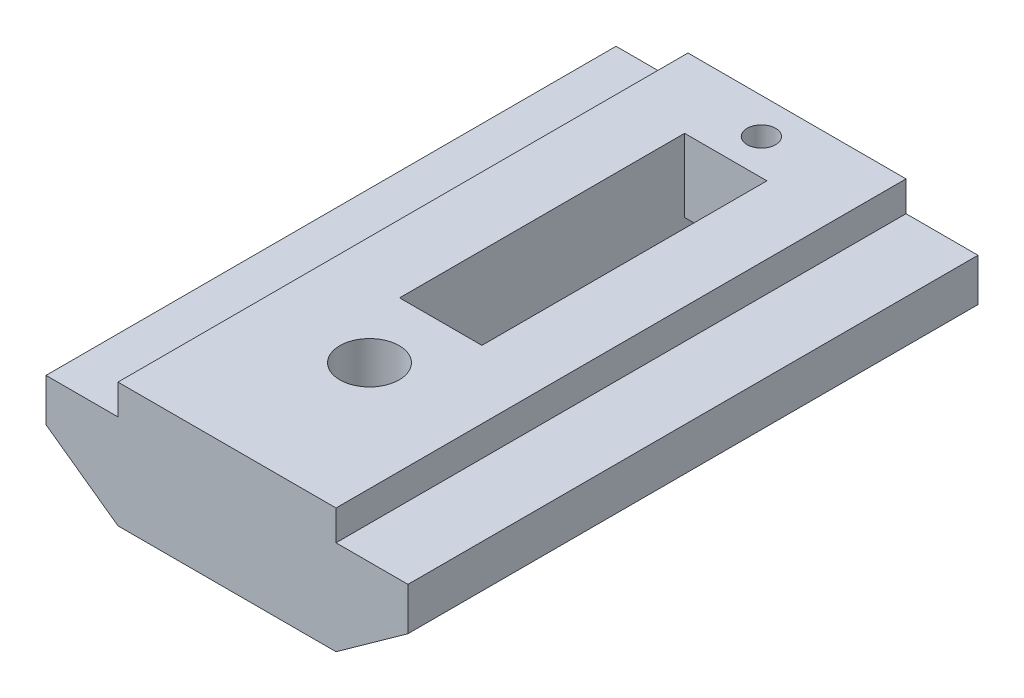
ISO-10303-21;
HEADER;
FILE_DESCRIPTION(('STEP AP214'),'2;1');
FILE_NAME('part.step','',(''),(''),'','','');
FILE_SCHEMA(('AUTOMOTIVE_DESIGN { 1 0 10303 214 1 1 1 1 }'));
ENDSEC;
DATA;
#1=APPLICATION_CONTEXT('core data for automotive mechanical design processes');
#2=APPLICATION_PROTOCOL_DEFINITION('international standard','automotive_design',2000,#1);
#3=PRODUCT_CONTEXT('',#1,'mechanical');
#4=PRODUCT('Part','Part','',(#3));
#5=PRODUCT_RELATED_PRODUCT_CATEGORY('part','',(#4));
#6=PRODUCT_DEFINITION_FORMATION('','',#4);
#7=PRODUCT_DEFINITION_CONTEXT('part definition',#1,'design');
#8=PRODUCT_DEFINITION('design','',#6,#7);
#9=PRODUCT_DEFINITION_SHAPE('','',#8);
#10=(LENGTH_UNIT() NAMED_UNIT(*) SI_UNIT(.MILLI.,.METRE.));
#11=(NAMED_UNIT(*) PLANE_ANGLE_UNIT() SI_UNIT($,.RADIAN.));
#12=(NAMED_UNIT(*) SI_UNIT($,.STERADIAN.) SOLID_ANGLE_UNIT());
#13=UNCERTAINTY_MEASURE_WITH_UNIT(LENGTH_MEASURE(1.E-05),#10,'distance_accuracy_value','');
#14=(GEOMETRIC_REPRESENTATION_CONTEXT(3) GLOBAL_UNCERTAINTY_ASSIGNED_CONTEXT((#13)) GLOBAL_UNIT_ASSIGNED_CONTEXT((#10,
#11,#12)) REPRESENTATION_CONTEXT('',''));
#15=CARTESIAN_POINT('',(0.,0.,0.));
#16=DIRECTION('',(0.,0.,1.));
#17=DIRECTION('',(1.,0.,0.));
#18=AXIS2_PLACEMENT_3D('',#15,#16,#17);
#19=CARTESIAN_POINT('',(0.,5.11666666666667,30.));
#20=DIRECTION('',(0.,-1.,0.));
#21=DIRECTION('',(0.,0.,-1.));
#22=AXIS2_PLACEMENT_3D('',#19,#20,#21);
#23=CYLINDRICAL_SURFACE('',#22,2.0828);
#24=CARTESIAN_POINT('',(0.,5.11666666666667,30.));
#25=DIRECTION('',(0.,-1.,0.));
#26=DIRECTION('',(0.,0.,-1.));
#27=AXIS2_PLACEMENT_3D('',#24,#25,#26);
#28=CIRCLE('',#27,2.0828);
#29=CARTESIAN_POINT('',(0.,5.11666666666667,27.9172));
#30=VERTEX_POINT('',#29);
#31=EDGE_CURVE('E171',#30,#30,#28,.T.);
#32=ORIENTED_EDGE('',*,*,#31,.F.);
#33=EDGE_LOOP('',(#32));
#34=FACE_BOUND('',#33,.T.);
#35=CARTESIAN_POINT('',(0.,-1.4102,30.));
#36=DIRECTION('',(0.,-1.,0.));
#37=DIRECTION('',(0.,0.,-1.));
#38=AXIS2_PLACEMENT_3D('',#35,#36,#37);
#39=CIRCLE('',#38,2.0828);
#40=CARTESIAN_POINT('',(0.,-1.4102,27.9172));
#41=VERTEX_POINT('',#40);
#42=EDGE_CURVE('E36',#41,#41,#39,.F.);
#43=ORIENTED_EDGE('',*,*,#42,.F.);
#44=EDGE_LOOP('',(#43));
#45=FACE_BOUND('',#44,.T.);
#46=ADVANCED_FACE('F32',(#34,#45),#23,.F.);
#47=CARTESIAN_POINT('',(7.65,5.11666666666667,40.));
#48=DIRECTION('',(-1.,0.,0.));
#49=DIRECTION('',(0.,-1.,0.));
#50=AXIS2_PLACEMENT_3D('',#47,#48,#49);
#51=PLANE('',#50);
#52=DIRECTION('',(0.,1.,0.));
#53=VECTOR('',#52,1.);
#54=CARTESIAN_POINT('',(7.65,5.11666666666667,0.));
#55=LINE('',#54,#53);
#56=CARTESIAN_POINT('',(7.65,3.,0.));
#57=VERTEX_POINT('',#56);
#58=CARTESIAN_POINT('',(7.65,5.11666666666667,0.));
#59=VERTEX_POINT('',#58);
#60=EDGE_CURVE('E185',#57,#59,#55,.T.);
#61=ORIENTED_EDGE('',*,*,#60,.T.);
#62=DIRECTION('',(0.,0.,-1.));
#63=VECTOR('',#62,1.);
#64=CARTESIAN_POINT('',(7.65,5.11666666666667,40.));
#65=LINE('',#64,#63);
#66=CARTESIAN_POINT('',(7.65,5.11666666666667,40.));
#67=VERTEX_POINT('',#66);
#68=EDGE_CURVE('E11',#67,#59,#65,.T.);
#69=ORIENTED_EDGE('',*,*,#68,.F.);
#70=DIRECTION('',(0.,1.,0.));
#71=VECTOR('',#70,1.);
#72=CARTESIAN_POINT('',(7.65,5.11666666666667,40.));
#73=LINE('',#72,#71);
#74=CARTESIAN_POINT('',(7.65,3.,40.));
#75=VERTEX_POINT('',#74);
#76=EDGE_CURVE('E187',#75,#67,#73,.T.);
#77=ORIENTED_EDGE('',*,*,#76,.F.);
#78=DIRECTION('',(0.,0.,-1.));
#79=VECTOR('',#78,1.);
#80=CARTESIAN_POINT('',(7.65,3.,40.));
#81=LINE('',#80,#79);
#82=EDGE_CURVE('E209',#75,#57,#81,.T.);
#83=ORIENTED_EDGE('',*,*,#82,.T.);
#84=EDGE_LOOP('',(#61,#69,#77,#83));
#85=FACE_BOUND('',#84,.T.);
#86=ADVANCED_FACE('F34',(#85),#51,.F.);
#87=CARTESIAN_POINT('',(-7.65,5.11666666666667,40.));
#88=DIRECTION('',(0.,-1.,0.));
#89=DIRECTION('',(1.,0.,0.));
#90=AXIS2_PLACEMENT_3D('',#87,#88,#89);
#91=PLANE('',#90);
#92=DIRECTION('',(1.,0.,0.));
#93=VECTOR('',#92,1.);
#94=CARTESIAN_POINT('',(-2.88833370117836,5.11666666666667,5.));
#95=LINE('',#94,#93);
#96=CARTESIAN_POINT('',(-2.88833370117836,5.11666666666667,5.));
#97=VERTEX_POINT('',#96);
#98=CARTESIAN_POINT('',(2.88833370117836,5.11666666666667,5.));
#99=VERTEX_POINT('',#98);
#100=EDGE_CURVE('E183',#97,#99,#95,.T.);
#101=ORIENTED_EDGE('',*,*,#100,.T.);
#102=DIRECTION('',(0.,0.,1.));
#103=VECTOR('',#102,1.);
#104=CARTESIAN_POINT('',(2.88833370117835,5.11666666666667,25.));
#105=LINE('',#104,#103);
#106=CARTESIAN_POINT('',(2.88833370117835,5.11666666666667,25.));
#107=VERTEX_POINT('',#106);
#108=EDGE_CURVE('E166',#99,#107,#105,.T.);
#109=ORIENTED_EDGE('',*,*,#108,.T.);
#110=DIRECTION('',(-1.,0.,0.));
#111=VECTOR('',#110,1.);
#112=CARTESIAN_POINT('',(-2.88833370117836,5.11666666666667,25.));
#113=LINE('',#112,#111);
#114=CARTESIAN_POINT('',(-2.88833370117837,5.11666666666667,25.));
#115=VERTEX_POINT('',#114);
#116=EDGE_CURVE('E322',#107,#115,#113,.T.);
#117=ORIENTED_EDGE('',*,*,#116,.T.);
#118=DIRECTION('',(0.,0.,-1.));
#119=VECTOR('',#118,1.);
#120=CARTESIAN_POINT('',(-2.88833370117836,5.11666666666667,25.));
#121=LINE('',#120,#119);
#122=EDGE_CURVE('E56',#115,#97,#121,.T.);
#123=ORIENTED_EDGE('',*,*,#122,.T.);
#124=EDGE_LOOP('',(#101,#109,#117,#123));
#125=FACE_BOUND('',#124,.T.);
#126=ORIENTED_EDGE('',*,*,#31,.T.);
#127=EDGE_LOOP('',(#126));
#128=FACE_BOUND('',#127,.T.);
#129=CARTESIAN_POINT('',(0.,5.11666666666667,2.5));
#130=DIRECTION('',(0.,-1.,0.));
#131=DIRECTION('',(0.,0.,-1.));
#132=AXIS2_PLACEMENT_3D('',#129,#130,#131);
#133=CIRCLE('',#132,1.);
#134=CARTESIAN_POINT('',(0.,5.11666666666667,1.5));
#135=VERTEX_POINT('',#134);
#136=EDGE_CURVE('E168',#135,#135,#133,.T.);
#137=ORIENTED_EDGE('',*,*,#136,.T.);
#138=EDGE_LOOP('',(#137));
#139=FACE_BOUND('',#138,.T.);
#140=DIRECTION('',(-1.,0.,0.));
#141=VECTOR('',#140,1.);
#142=CARTESIAN_POINT('',(-7.65,5.11666666666667,0.));
#143=LINE('',#142,#141);
#144=CARTESIAN_POINT('',(-7.65,5.11666666666667,0.));
#145=VERTEX_POINT('',#144);
#146=EDGE_CURVE('E212',#59,#145,#143,.T.);
#147=ORIENTED_EDGE('',*,*,#146,.T.);
#148=DIRECTION('',(0.,0.,-1.));
#149=VECTOR('',#148,1.);
#150=CARTESIAN_POINT('',(-7.65,5.11666666666667,40.));
#151=LINE('',#150,#149);
#152=CARTESIAN_POINT('',(-7.65,5.11666666666667,40.));
#153=VERTEX_POINT('',#152);
#154=EDGE_CURVE('E41',#153,#145,#151,.T.);
#155=ORIENTED_EDGE('',*,*,#154,.F.);
#156=DIRECTION('',(-1.,0.,0.));
#157=VECTOR('',#156,1.);
#158=CARTESIAN_POINT('',(-7.65,5.11666666666667,40.));
#159=LINE('',#158,#157);
#160=EDGE_CURVE('E190',#67,#153,#159,.T.);
#161=ORIENTED_EDGE('',*,*,#160,.F.);
#162=ORIENTED_EDGE('',*,*,#68,.T.);
#163=EDGE_LOOP('',(#147,#155,#161,#162));
#164=FACE_BOUND('',#163,.T.);
#165=ADVANCED_FACE('F282',(#125,#128,#139,#164),#91,.F.);
#166=CARTESIAN_POINT('',(-7.65,5.11666666666667,40.));
#167=DIRECTION('',(1.,0.,0.));
#168=DIRECTION('',(0.,1.,0.));
#169=AXIS2_PLACEMENT_3D('',#166,#167,#168);
#170=PLANE('',#169);
#171=DIRECTION('',(0.,-1.,0.));
#172=VECTOR('',#171,1.);
#173=CARTESIAN_POINT('',(-7.65,5.11666666666667,0.));
#174=LINE('',#173,#172);
#175=CARTESIAN_POINT('',(-7.65,3.,0.));
#176=VERTEX_POINT('',#175);
#177=EDGE_CURVE('E214',#145,#176,#174,.T.);
#178=ORIENTED_EDGE('',*,*,#177,.T.);
#179=DIRECTION('',(0.,0.,-1.));
#180=VECTOR('',#179,1.);
#181=CARTESIAN_POINT('',(-7.65,3.,40.));
#182=LINE('',#181,#180);
#183=CARTESIAN_POINT('',(-7.65,3.,40.));
#184=VERTEX_POINT('',#183);
#185=EDGE_CURVE('E251',#184,#176,#182,.T.);
#186=ORIENTED_EDGE('',*,*,#185,.F.);
#187=DIRECTION('',(0.,-1.,0.));
#188=VECTOR('',#187,1.);
#189=CARTESIAN_POINT('',(-7.65,5.11666666666667,40.));
#190=LINE('',#189,#188);
#191=EDGE_CURVE('E193',#153,#184,#190,.T.);
#192=ORIENTED_EDGE('',*,*,#191,.F.);
#193=ORIENTED_EDGE('',*,*,#154,.T.);
#194=EDGE_LOOP('',(#178,#186,#192,#193));
#195=FACE_BOUND('',#194,.T.);
#196=ADVANCED_FACE('F259',(#195),#170,.F.);
#197=CARTESIAN_POINT('',(-12.7,3.,40.));
#198=DIRECTION('',(0.,-1.,0.));
#199=DIRECTION('',(1.,0.,0.));
#200=AXIS2_PLACEMENT_3D('',#197,#198,#199);
#201=PLANE('',#200);
#202=DIRECTION('',(-1.,0.,0.));
#203=VECTOR('',#202,1.);
#204=CARTESIAN_POINT('',(-12.7,3.,0.));
#205=LINE('',#204,#203);
#206=CARTESIAN_POINT('',(-12.7,3.,0.));
#207=VERTEX_POINT('',#206);
#208=EDGE_CURVE('E216',#176,#207,#205,.T.);
#209=ORIENTED_EDGE('',*,*,#208,.T.);
#210=DIRECTION('',(0.,0.,-1.));
#211=VECTOR('',#210,1.);
#212=CARTESIAN_POINT('',(-12.7,3.,40.));
#213=LINE('',#212,#211);
#214=CARTESIAN_POINT('',(-12.7,3.,40.));
#215=VERTEX_POINT('',#214);
#216=EDGE_CURVE('E248',#215,#207,#213,.T.);
#217=ORIENTED_EDGE('',*,*,#216,.F.);
#218=DIRECTION('',(-1.,0.,0.));
#219=VECTOR('',#218,1.);
#220=CARTESIAN_POINT('',(-12.7,3.,40.));
#221=LINE('',#220,#219);
#222=EDGE_CURVE('E195',#184,#215,#221,.T.);
#223=ORIENTED_EDGE('',*,*,#222,.F.);
#224=ORIENTED_EDGE('',*,*,#185,.T.);
#225=EDGE_LOOP('',(#209,#217,#223,#224));
#226=FACE_BOUND('',#225,.T.);
#227=ADVANCED_FACE('F270',(#226),#201,.F.);
#228=CARTESIAN_POINT('',(-12.7,0.,40.));
#229=DIRECTION('',(1.,0.,0.));
#230=DIRECTION('',(0.,0.,-1.));
#231=AXIS2_PLACEMENT_3D('',#228,#229,#230);
#232=PLANE('',#231);
#233=DIRECTION('',(0.,-1.,0.));
#234=VECTOR('',#233,1.);
#235=CARTESIAN_POINT('',(-12.7,0.,0.));
#236=LINE('',#235,#234);
#237=CARTESIAN_POINT('',(-12.7,0.,0.));
#238=VERTEX_POINT('',#237);
#239=EDGE_CURVE('E218',#207,#238,#236,.T.);
#240=ORIENTED_EDGE('',*,*,#239,.T.);
#241=DIRECTION('',(0.,0.,-1.));
#242=VECTOR('',#241,1.);
#243=CARTESIAN_POINT('',(-12.7,0.,40.));
#244=LINE('',#243,#242);
#245=CARTESIAN_POINT('',(-12.7,0.,40.));
#246=VERTEX_POINT('',#245);
#247=EDGE_CURVE('E245',#246,#238,#244,.T.);
#248=ORIENTED_EDGE('',*,*,#247,.F.);
#249=DIRECTION('',(0.,-1.,0.));
#250=VECTOR('',#249,1.);
#251=CARTESIAN_POINT('',(-12.7,0.,40.));
#252=LINE('',#251,#250);
#253=EDGE_CURVE('E197',#215,#246,#252,.T.);
#254=ORIENTED_EDGE('',*,*,#253,.F.);
#255=ORIENTED_EDGE('',*,*,#216,.T.);
#256=EDGE_LOOP('',(#240,#248,#254,#255));
#257=FACE_BOUND('',#256,.T.);
#258=ADVANCED_FACE('F274',(#257),#232,.F.);
#259=CARTESIAN_POINT('',(-12.7,0.,40.));
#260=DIRECTION('',(0.582607545772361,0.812753620483543,0.));
#261=DIRECTION('',(-0.812753620483543,0.582607545772361,0.));
#262=AXIS2_PLACEMENT_3D('',#259,#260,#261);
#263=PLANE('',#262);
#264=DIRECTION('',(0.812753620483542,-0.582607545772361,0.));
#265=VECTOR('',#264,1.);
#266=CARTESIAN_POINT('',(-12.7,0.,0.));
#267=LINE('',#266,#265);
#268=CARTESIAN_POINT('',(-7.65,-3.62,0.));
#269=VERTEX_POINT('',#268);
#270=EDGE_CURVE('E220',#238,#269,#267,.T.);
#271=ORIENTED_EDGE('',*,*,#270,.T.);
#272=DIRECTION('',(0.,0.,-1.));
#273=VECTOR('',#272,1.);
#274=CARTESIAN_POINT('',(-7.65,-3.62,40.));
#275=LINE('',#274,#273);
#276=CARTESIAN_POINT('',(-7.65,-3.62,40.));
#277=VERTEX_POINT('',#276);
#278=EDGE_CURVE('E242',#277,#269,#275,.T.);
#279=ORIENTED_EDGE('',*,*,#278,.F.);
#280=DIRECTION('',(0.812753620483542,-0.582607545772361,0.));
#281=VECTOR('',#280,1.);
#282=CARTESIAN_POINT('',(-12.7,0.,40.));
#283=LINE('',#282,#281);
#284=EDGE_CURVE('E199',#246,#277,#283,.T.);
#285=ORIENTED_EDGE('',*,*,#284,.F.);
#286=ORIENTED_EDGE('',*,*,#247,.T.);
#287=EDGE_LOOP('',(#271,#279,#285,#286));
#288=FACE_BOUND('',#287,.T.);
#289=ADVANCED_FACE('F330',(#288),#263,.F.);
#290=CARTESIAN_POINT('',(7.65,-3.62,40.));
#291=DIRECTION('',(0.,1.,0.));
#292=DIRECTION('',(0.,0.,1.));
#293=AXIS2_PLACEMENT_3D('',#290,#291,#292);
#294=PLANE('',#293);
#295=CARTESIAN_POINT('',(0.,-3.62,30.));
#296=DIRECTION('',(0.,-1.,0.));
#297=DIRECTION('',(0.,0.,-1.));
#298=AXIS2_PLACEMENT_3D('',#295,#296,#297);
#299=CIRCLE('',#298,4.0005);
#300=CARTESIAN_POINT('',(0.,-3.62,25.9995));
#301=VERTEX_POINT('',#300);
#302=EDGE_CURVE('E526',#301,#301,#299,.T.);
#303=ORIENTED_EDGE('',*,*,#302,.F.);
#304=EDGE_LOOP('',(#303));
#305=FACE_BOUND('',#304,.T.);
#306=DIRECTION('',(0.,0.,1.));
#307=VECTOR('',#306,1.);
#308=CARTESIAN_POINT('',(2.88833370117835,-3.62,25.));
#309=LINE('',#308,#307);
#310=CARTESIAN_POINT('',(2.88833370117836,-3.62,0.));
#311=VERTEX_POINT('',#310);
#312=CARTESIAN_POINT('',(2.88833370117835,-3.62,25.));
#313=VERTEX_POINT('',#312);
#314=EDGE_CURVE('E306',#311,#313,#309,.T.);
#315=ORIENTED_EDGE('',*,*,#314,.F.);
#316=DIRECTION('',(1.,0.,0.));
#317=VECTOR('',#316,1.);
#318=CARTESIAN_POINT('',(7.65,-3.62,0.));
#319=LINE('',#318,#317);
#320=CARTESIAN_POINT('',(7.65,-3.62,0.));
#321=VERTEX_POINT('',#320);
#322=EDGE_CURVE('E222',#311,#321,#319,.T.);
#323=ORIENTED_EDGE('',*,*,#322,.T.);
#324=DIRECTION('',(0.,0.,-1.));
#325=VECTOR('',#324,1.);
#326=CARTESIAN_POINT('',(7.65,-3.62,40.));
#327=LINE('',#326,#325);
#328=CARTESIAN_POINT('',(7.65,-3.62,40.));
#329=VERTEX_POINT('',#328);
#330=EDGE_CURVE('E239',#329,#321,#327,.T.);
#331=ORIENTED_EDGE('',*,*,#330,.F.);
#332=DIRECTION('',(1.,0.,0.));
#333=VECTOR('',#332,1.);
#334=CARTESIAN_POINT('',(7.65,-3.62,40.));
#335=LINE('',#334,#333);
#336=EDGE_CURVE('E201',#277,#329,#335,.T.);
#337=ORIENTED_EDGE('',*,*,#336,.F.);
#338=ORIENTED_EDGE('',*,*,#278,.T.);
#339=CARTESIAN_POINT('',(-2.88833370117836,-3.62,0.));
#340=VERTEX_POINT('',#339);
#341=EDGE_CURVE('E223',#269,#340,#319,.T.);
#342=ORIENTED_EDGE('',*,*,#341,.T.);
#343=DIRECTION('',(0.,0.,-1.));
#344=VECTOR('',#343,1.);
#345=CARTESIAN_POINT('',(-2.88833370117836,-3.62,25.));
#346=LINE('',#345,#344);
#347=CARTESIAN_POINT('',(-2.88833370117836,-3.62,25.));
#348=VERTEX_POINT('',#347);
#349=EDGE_CURVE('E176',#348,#340,#346,.T.);
#350=ORIENTED_EDGE('',*,*,#349,.F.);
#351=DIRECTION('',(-1.,0.,0.));
#352=VECTOR('',#351,1.);
#353=CARTESIAN_POINT('',(-2.88833370117836,-3.62,25.));
#354=LINE('',#353,#352);
#355=EDGE_CURVE('E309',#313,#348,#354,.T.);
#356=ORIENTED_EDGE('',*,*,#355,.F.);
#357=EDGE_LOOP('',(#315,#323,#331,#337,#338,#342,#350,#356));
#358=FACE_BOUND('',#357,.T.);
#359=ADVANCED_FACE('F303',(#305,#358),#294,.F.);
#360=CARTESIAN_POINT('',(7.65,-3.62,40.));
#361=DIRECTION('',(-0.582607545772361,0.812753620483543,0.));
#362=DIRECTION('',(-0.812753620483543,-0.582607545772361,0.));
#363=AXIS2_PLACEMENT_3D('',#360,#361,#362);
#364=PLANE('',#363);
#365=DIRECTION('',(0.812753620483542,0.582607545772361,0.));
#366=VECTOR('',#365,1.);
#367=CARTESIAN_POINT('',(7.65,-3.62,0.));
#368=LINE('',#367,#366);
#369=CARTESIAN_POINT('',(12.7,0.,0.));
#370=VERTEX_POINT('',#369);
#371=EDGE_CURVE('E226',#321,#370,#368,.T.);
#372=ORIENTED_EDGE('',*,*,#371,.T.);
#373=DIRECTION('',(0.,0.,-1.));
#374=VECTOR('',#373,1.);
#375=CARTESIAN_POINT('',(12.7,0.,40.));
#376=LINE('',#375,#374);
#377=CARTESIAN_POINT('',(12.7,0.,40.));
#378=VERTEX_POINT('',#377);
#379=EDGE_CURVE('E236',#378,#370,#376,.T.);
#380=ORIENTED_EDGE('',*,*,#379,.F.);
#381=DIRECTION('',(0.812753620483542,0.582607545772361,0.));
#382=VECTOR('',#381,1.);
#383=CARTESIAN_POINT('',(7.65,-3.62,40.));
#384=LINE('',#383,#382);
#385=EDGE_CURVE('E203',#329,#378,#384,.T.);
#386=ORIENTED_EDGE('',*,*,#385,.F.);
#387=ORIENTED_EDGE('',*,*,#330,.T.);
#388=EDGE_LOOP('',(#372,#380,#386,#387));
#389=FACE_BOUND('',#388,.T.);
#390=ADVANCED_FACE('F298',(#389),#364,.F.);
#391=CARTESIAN_POINT('',(12.7,0.,40.));
#392=DIRECTION('',(-1.,0.,0.));
#393=DIRECTION('',(0.,0.,1.));
#394=AXIS2_PLACEMENT_3D('',#391,#392,#393);
#395=PLANE('',#394);
#396=DIRECTION('',(0.,1.,0.));
#397=VECTOR('',#396,1.);
#398=CARTESIAN_POINT('',(12.7,0.,0.));
#399=LINE('',#398,#397);
#400=CARTESIAN_POINT('',(12.7,3.,0.));
#401=VERTEX_POINT('',#400);
#402=EDGE_CURVE('E228',#370,#401,#399,.T.);
#403=ORIENTED_EDGE('',*,*,#402,.T.);
#404=DIRECTION('',(0.,0.,-1.));
#405=VECTOR('',#404,1.);
#406=CARTESIAN_POINT('',(12.7,3.,40.));
#407=LINE('',#406,#405);
#408=CARTESIAN_POINT('',(12.7,3.,40.));
#409=VERTEX_POINT('',#408);
#410=EDGE_CURVE('E233',#409,#401,#407,.T.);
#411=ORIENTED_EDGE('',*,*,#410,.F.);
#412=DIRECTION('',(0.,1.,0.));
#413=VECTOR('',#412,1.);
#414=CARTESIAN_POINT('',(12.7,0.,40.));
#415=LINE('',#414,#413);
#416=EDGE_CURVE('E205',#378,#409,#415,.T.);
#417=ORIENTED_EDGE('',*,*,#416,.F.);
#418=ORIENTED_EDGE('',*,*,#379,.T.);
#419=EDGE_LOOP('',(#403,#411,#417,#418));
#420=FACE_BOUND('',#419,.T.);
#421=ADVANCED_FACE('F294',(#420),#395,.F.);
#422=CARTESIAN_POINT('',(12.7,3.,40.));
#423=DIRECTION('',(0.,-1.,0.));
#424=DIRECTION('',(1.,0.,0.));
#425=AXIS2_PLACEMENT_3D('',#422,#423,#424);
#426=PLANE('',#425);
#427=DIRECTION('',(-1.,0.,0.));
#428=VECTOR('',#427,1.);
#429=CARTESIAN_POINT('',(12.7,3.,0.));
#430=LINE('',#429,#428);
#431=EDGE_CURVE('E191',#401,#57,#430,.T.);
#432=ORIENTED_EDGE('',*,*,#431,.T.);
#433=ORIENTED_EDGE('',*,*,#82,.F.);
#434=DIRECTION('',(-1.,0.,0.));
#435=VECTOR('',#434,1.);
#436=CARTESIAN_POINT('',(12.7,3.,40.));
#437=LINE('',#436,#435);
#438=EDGE_CURVE('E207',#409,#75,#437,.T.);
#439=ORIENTED_EDGE('',*,*,#438,.F.);
#440=ORIENTED_EDGE('',*,*,#410,.T.);
#441=EDGE_LOOP('',(#432,#433,#439,#440));
#442=FACE_BOUND('',#441,.T.);
#443=ADVANCED_FACE('F289',(#442),#426,.F.);
#444=CARTESIAN_POINT('',(0.,0.,40.));
#445=DIRECTION('',(0.,0.,-1.));
#446=DIRECTION('',(-1.,0.,0.));
#447=AXIS2_PLACEMENT_3D('',#444,#445,#446);
#448=PLANE('',#447);
#449=ORIENTED_EDGE('',*,*,#76,.T.);
#450=ORIENTED_EDGE('',*,*,#160,.T.);
#451=ORIENTED_EDGE('',*,*,#191,.T.);
#452=ORIENTED_EDGE('',*,*,#222,.T.);
#453=ORIENTED_EDGE('',*,*,#253,.T.);
#454=ORIENTED_EDGE('',*,*,#284,.T.);
#455=ORIENTED_EDGE('',*,*,#336,.T.);
#456=ORIENTED_EDGE('',*,*,#385,.T.);
#457=ORIENTED_EDGE('',*,*,#416,.T.);
#458=ORIENTED_EDGE('',*,*,#438,.T.);
#459=EDGE_LOOP('',(#449,#450,#451,#452,#453,#454,#455,#456,#457,#458));
#460=FACE_BOUND('',#459,.T.);
#461=ADVANCED_FACE('F278',(#460),#448,.F.);
#462=CARTESIAN_POINT('',(0.,0.,0.));
#463=DIRECTION('',(0.,0.,-1.));
#464=DIRECTION('',(-1.,0.,0.));
#465=AXIS2_PLACEMENT_3D('',#462,#463,#464);
#466=PLANE('',#465);
#467=DIRECTION('',(0.,-1.,0.));
#468=VECTOR('',#467,1.);
#469=CARTESIAN_POINT('',(2.88833370117836,0.,0.));
#470=LINE('',#469,#468);
#471=CARTESIAN_POINT('',(2.88833370117836,0.,0.));
#472=VERTEX_POINT('',#471);
#473=EDGE_CURVE('E301',#472,#311,#470,.T.);
#474=ORIENTED_EDGE('',*,*,#473,.F.);
#475=DIRECTION('',(1.,0.,0.));
#476=VECTOR('',#475,1.);
#477=CARTESIAN_POINT('',(-2.88833370117836,0.,0.));
#478=LINE('',#477,#476);
#479=CARTESIAN_POINT('',(-2.88833370117836,0.,0.));
#480=VERTEX_POINT('',#479);
#481=EDGE_CURVE('E149',#480,#472,#478,.T.);
#482=ORIENTED_EDGE('',*,*,#481,.F.);
#483=DIRECTION('',(0.,-1.,0.));
#484=VECTOR('',#483,1.);
#485=CARTESIAN_POINT('',(-2.88833370117836,0.,0.));
#486=LINE('',#485,#484);
#487=EDGE_CURVE('E312',#480,#340,#486,.T.);
#488=ORIENTED_EDGE('',*,*,#487,.T.);
#489=ORIENTED_EDGE('',*,*,#341,.F.);
#490=ORIENTED_EDGE('',*,*,#270,.F.);
#491=ORIENTED_EDGE('',*,*,#239,.F.);
#492=ORIENTED_EDGE('',*,*,#208,.F.);
#493=ORIENTED_EDGE('',*,*,#177,.F.);
#494=ORIENTED_EDGE('',*,*,#146,.F.);
#495=ORIENTED_EDGE('',*,*,#60,.F.);
#496=ORIENTED_EDGE('',*,*,#431,.F.);
#497=ORIENTED_EDGE('',*,*,#402,.F.);
#498=ORIENTED_EDGE('',*,*,#371,.F.);
#499=ORIENTED_EDGE('',*,*,#322,.F.);
#500=EDGE_LOOP('',(#474,#482,#488,#489,#490,#491,#492,#493,#494,#495,#496,#497,#498,#499));
#501=FACE_BOUND('',#500,.T.);
#502=ADVANCED_FACE('F264',(#501),#466,.T.);
#503=CARTESIAN_POINT('',(0.,5.11666666666667,2.5));
#504=DIRECTION('',(0.,-1.,0.));
#505=DIRECTION('',(0.,0.,-1.));
#506=AXIS2_PLACEMENT_3D('',#503,#504,#505);
#507=CYLINDRICAL_SURFACE('',#506,1.);
#508=CARTESIAN_POINT('',(0.,0.,2.5));
#509=DIRECTION('',(0.,1.,0.));
#510=DIRECTION('',(0.,0.,1.));
#511=AXIS2_PLACEMENT_3D('',#508,#509,#510);
#512=CIRCLE('',#511,1.);
#513=CARTESIAN_POINT('',(0.,0.,3.5));
#514=VERTEX_POINT('',#513);
#515=EDGE_CURVE('E310',#514,#514,#512,.F.);
#516=ORIENTED_EDGE('',*,*,#515,.T.);
#517=EDGE_LOOP('',(#516));
#518=FACE_BOUND('',#517,.T.);
#519=ORIENTED_EDGE('',*,*,#136,.F.);
#520=EDGE_LOOP('',(#519));
#521=FACE_BOUND('',#520,.T.);
#522=ADVANCED_FACE('F351',(#518,#521),#507,.F.);
#523=CARTESIAN_POINT('',(2.88833370117835,5.11666666666667,25.));
#524=DIRECTION('',(1.,0.,0.));
#525=DIRECTION('',(0.,0.,-1.));
#526=AXIS2_PLACEMENT_3D('',#523,#524,#525);
#527=PLANE('',#526);
#528=ORIENTED_EDGE('',*,*,#314,.T.);
#529=DIRECTION('',(0.,-1.,0.));
#530=VECTOR('',#529,1.);
#531=CARTESIAN_POINT('',(2.88833370117835,5.11666666666667,25.));
#532=LINE('',#531,#530);
#533=EDGE_CURVE('E180',#107,#313,#532,.T.);
#534=ORIENTED_EDGE('',*,*,#533,.F.);
#535=ORIENTED_EDGE('',*,*,#108,.F.);
#536=DIRECTION('',(0.,-1.,0.));
#537=VECTOR('',#536,1.);
#538=CARTESIAN_POINT('',(2.88833370117836,5.11666666666667,5.));
#539=LINE('',#538,#537);
#540=CARTESIAN_POINT('',(2.88833370117836,0.,5.));
#541=VERTEX_POINT('',#540);
#542=EDGE_CURVE('E159',#99,#541,#539,.T.);
#543=ORIENTED_EDGE('',*,*,#542,.T.);
#544=DIRECTION('',(0.,0.,1.));
#545=VECTOR('',#544,1.);
#546=CARTESIAN_POINT('',(2.88833370117836,0.,0.));
#547=LINE('',#546,#545);
#548=EDGE_CURVE('E145',#472,#541,#547,.T.);
#549=ORIENTED_EDGE('',*,*,#548,.F.);
#550=ORIENTED_EDGE('',*,*,#473,.T.);
#551=EDGE_LOOP('',(#528,#534,#535,#543,#549,#550));
#552=FACE_BOUND('',#551,.T.);
#553=ADVANCED_FACE('F164',(#552),#527,.F.);
#554=CARTESIAN_POINT('',(-2.88833370117836,5.11666666666667,5.));
#555=DIRECTION('',(0.,0.,-1.));
#556=DIRECTION('',(-1.,0.,0.));
#557=AXIS2_PLACEMENT_3D('',#554,#555,#556);
#558=PLANE('',#557);
#559=DIRECTION('',(0.,-1.,0.));
#560=VECTOR('',#559,1.);
#561=CARTESIAN_POINT('',(-2.88833370117836,5.11666666666667,5.));
#562=LINE('',#561,#560);
#563=CARTESIAN_POINT('',(-2.88833370117836,0.,5.));
#564=VERTEX_POINT('',#563);
#565=EDGE_CURVE('E161',#97,#564,#562,.T.);
#566=ORIENTED_EDGE('',*,*,#565,.T.);
#567=DIRECTION('',(-1.,0.,0.));
#568=VECTOR('',#567,1.);
#569=CARTESIAN_POINT('',(-2.88833370117836,0.,5.));
#570=LINE('',#569,#568);
#571=EDGE_CURVE('E48',#541,#564,#570,.T.);
#572=ORIENTED_EDGE('',*,*,#571,.F.);
#573=ORIENTED_EDGE('',*,*,#542,.F.);
#574=ORIENTED_EDGE('',*,*,#100,.F.);
#575=EDGE_LOOP('',(#566,#572,#573,#574));
#576=FACE_BOUND('',#575,.T.);
#577=ADVANCED_FACE('F157',(#576),#558,.F.);
#578=CARTESIAN_POINT('',(-2.88833370117836,5.11666666666667,25.));
#579=DIRECTION('',(-1.,0.,0.));
#580=DIRECTION('',(0.,0.,1.));
#581=AXIS2_PLACEMENT_3D('',#578,#579,#580);
#582=PLANE('',#581);
#583=ORIENTED_EDGE('',*,*,#349,.T.);
#584=ORIENTED_EDGE('',*,*,#487,.F.);
#585=DIRECTION('',(0.,0.,-1.));
#586=VECTOR('',#585,1.);
#587=CARTESIAN_POINT('',(-2.88833370117836,0.,0.));
#588=LINE('',#587,#586);
#589=EDGE_CURVE('E162',#564,#480,#588,.T.);
#590=ORIENTED_EDGE('',*,*,#589,.F.);
#591=ORIENTED_EDGE('',*,*,#565,.F.);
#592=ORIENTED_EDGE('',*,*,#122,.F.);
#593=DIRECTION('',(0.,-1.,0.));
#594=VECTOR('',#593,1.);
#595=CARTESIAN_POINT('',(-2.88833370117836,5.11666666666667,25.));
#596=LINE('',#595,#594);
#597=EDGE_CURVE('E173',#115,#348,#596,.T.);
#598=ORIENTED_EDGE('',*,*,#597,.T.);
#599=EDGE_LOOP('',(#583,#584,#590,#591,#592,#598));
#600=FACE_BOUND('',#599,.T.);
#601=ADVANCED_FACE('F327',(#600),#582,.F.);
#602=CARTESIAN_POINT('',(-2.88833370117836,5.11666666666667,25.));
#603=DIRECTION('',(0.,0.,1.));
#604=DIRECTION('',(1.,0.,0.));
#605=AXIS2_PLACEMENT_3D('',#602,#603,#604);
#606=PLANE('',#605);
#607=ORIENTED_EDGE('',*,*,#355,.T.);
#608=ORIENTED_EDGE('',*,*,#597,.F.);
#609=ORIENTED_EDGE('',*,*,#116,.F.);
#610=ORIENTED_EDGE('',*,*,#533,.T.);
#611=EDGE_LOOP('',(#607,#608,#609,#610));
#612=FACE_BOUND('',#611,.T.);
#613=ADVANCED_FACE('F407',(#612),#606,.F.);
#614=CARTESIAN_POINT('',(0.,0.,0.));
#615=DIRECTION('',(0.,1.,0.));
#616=DIRECTION('',(0.,0.,1.));
#617=AXIS2_PLACEMENT_3D('',#614,#615,#616);
#618=PLANE('',#617);
#619=ORIENTED_EDGE('',*,*,#548,.T.);
#620=ORIENTED_EDGE('',*,*,#571,.T.);
#621=ORIENTED_EDGE('',*,*,#589,.T.);
#622=ORIENTED_EDGE('',*,*,#481,.T.);
#623=EDGE_LOOP('',(#619,#620,#621,#622));
#624=FACE_BOUND('',#623,.T.);
#625=ORIENTED_EDGE('',*,*,#515,.F.);
#626=EDGE_LOOP('',(#625));
#627=FACE_BOUND('',#626,.T.);
#628=ADVANCED_FACE('F146',(#624,#627),#618,.F.);
#629=CARTESIAN_POINT('',(0.,-1.4102,30.));
#630=DIRECTION('',(0.,-1.,0.));
#631=DIRECTION('',(0.,0.,-1.));
#632=AXIS2_PLACEMENT_3D('',#629,#630,#631);
#633=PLANE('',#632);
#634=CARTESIAN_POINT('',(0.,-1.4102,30.));
#635=DIRECTION('',(0.,-1.,0.));
#636=DIRECTION('',(0.,0.,-1.));
#637=AXIS2_PLACEMENT_3D('',#634,#635,#636);
#638=CIRCLE('',#637,4.0005);
#639=CARTESIAN_POINT('',(0.,-1.4102,25.9995));
#640=VERTEX_POINT('',#639);
#641=EDGE_CURVE('E523',#640,#640,#638,.T.);
#642=ORIENTED_EDGE('',*,*,#641,.T.);
#643=EDGE_LOOP('',(#642));
#644=FACE_BOUND('',#643,.T.);
#645=ORIENTED_EDGE('',*,*,#42,.T.);
#646=EDGE_LOOP('',(#645));
#647=FACE_BOUND('',#646,.T.);
#648=ADVANCED_FACE('F418',(#644,#647),#633,.T.);
#649=CARTESIAN_POINT('',(0.,-1.4102,30.));
#650=DIRECTION('',(0.,-1.,0.));
#651=DIRECTION('',(0.,0.,-1.));
#652=AXIS2_PLACEMENT_3D('',#649,#650,#651);
#653=CYLINDRICAL_SURFACE('',#652,4.0005);
#654=ORIENTED_EDGE('',*,*,#641,.F.);
#655=EDGE_LOOP('',(#654));
#656=FACE_BOUND('',#655,.T.);
#657=ORIENTED_EDGE('',*,*,#302,.T.);
#658=EDGE_LOOP('',(#657));
#659=FACE_BOUND('',#658,.T.);
#660=ADVANCED_FACE('F425',(#656,#659),#653,.F.);
#661=CLOSED_SHELL('',(#46,#86,#165,#196,#227,#258,#289,#359,#390,#421,#443,#461,#502,#522,#553,
#577,#601,#613,#628,#648,#660));
#662=MANIFOLD_SOLID_BREP('B2',#661);
#663=ADVANCED_BREP_SHAPE_REPRESENTATION('',(#18,#662),#14);
#664=SHAPE_DEFINITION_REPRESENTATION(#9,#663);
ENDSEC;
END-ISO-10303-21;
